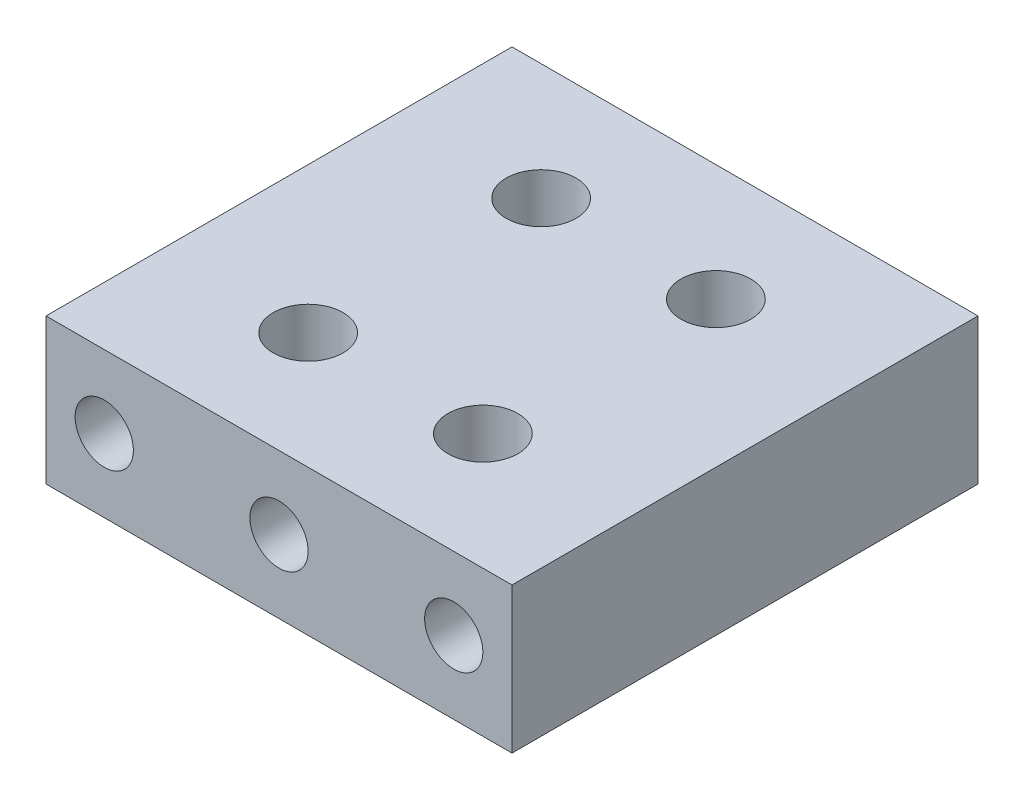
ISO-10303-21;
HEADER;
FILE_DESCRIPTION(('STEP AP214'),'2;1');
FILE_NAME('part.step','',(''),(''),'','','');
FILE_SCHEMA(('AUTOMOTIVE_DESIGN { 1 0 10303 214 1 1 1 1 }'));
ENDSEC;
DATA;
#1=APPLICATION_CONTEXT('core data for automotive mechanical design processes');
#2=APPLICATION_PROTOCOL_DEFINITION('international standard','automotive_design',2000,#1);
#3=PRODUCT_CONTEXT('',#1,'mechanical');
#4=PRODUCT('Part','Part','',(#3));
#5=PRODUCT_RELATED_PRODUCT_CATEGORY('part','',(#4));
#6=PRODUCT_DEFINITION_FORMATION('','',#4);
#7=PRODUCT_DEFINITION_CONTEXT('part definition',#1,'design');
#8=PRODUCT_DEFINITION('design','',#6,#7);
#9=PRODUCT_DEFINITION_SHAPE('','',#8);
#10=(LENGTH_UNIT() NAMED_UNIT(*) SI_UNIT(.MILLI.,.METRE.));
#11=(NAMED_UNIT(*) PLANE_ANGLE_UNIT() SI_UNIT($,.RADIAN.));
#12=(NAMED_UNIT(*) SI_UNIT($,.STERADIAN.) SOLID_ANGLE_UNIT());
#13=UNCERTAINTY_MEASURE_WITH_UNIT(LENGTH_MEASURE(1.E-05),#10,'distance_accuracy_value','');
#14=(GEOMETRIC_REPRESENTATION_CONTEXT(3) GLOBAL_UNCERTAINTY_ASSIGNED_CONTEXT((#13)) GLOBAL_UNIT_ASSIGNED_CONTEXT((#10,
#11,#12)) REPRESENTATION_CONTEXT('',''));
#15=CARTESIAN_POINT('',(0.,0.,0.));
#16=DIRECTION('',(0.,0.,1.));
#17=DIRECTION('',(1.,0.,0.));
#18=AXIS2_PLACEMENT_3D('',#15,#16,#17);
#19=CARTESIAN_POINT('',(-9.525,15.875,12.7));
#20=DIRECTION('',(0.,1.,0.));
#21=DIRECTION('',(0.,0.,1.));
#22=AXIS2_PLACEMENT_3D('',#19,#20,#21);
#23=CYLINDRICAL_SURFACE('',#22,1.7272);
#24=CARTESIAN_POINT('',(-9.525,0.,12.7));
#25=DIRECTION('',(0.,1.,0.));
#26=DIRECTION('',(0.,0.,1.));
#27=AXIS2_PLACEMENT_3D('',#24,#25,#26);
#28=CIRCLE('',#27,1.7272);
#29=CARTESIAN_POINT('',(-9.525,0.,14.4272));
#30=VERTEX_POINT('',#29);
#31=EDGE_CURVE('E114',#30,#30,#28,.T.);
#32=ORIENTED_EDGE('',*,*,#31,.F.);
#33=EDGE_LOOP('',(#32));
#34=FACE_BOUND('',#33,.T.);
#35=CARTESIAN_POINT('',(-9.525,9.525,12.7));
#36=DIRECTION('',(0.,1.,0.));
#37=DIRECTION('',(0.,0.,1.));
#38=AXIS2_PLACEMENT_3D('',#35,#36,#37);
#39=CIRCLE('',#38,1.7272);
#40=CARTESIAN_POINT('',(-9.525,9.525,14.4272));
#41=VERTEX_POINT('',#40);
#42=EDGE_CURVE('E39',#41,#41,#39,.F.);
#43=ORIENTED_EDGE('',*,*,#42,.F.);
#44=EDGE_LOOP('',(#43));
#45=FACE_BOUND('',#44,.T.);
#46=ADVANCED_FACE('F35',(#34,#45),#23,.F.);
#47=CARTESIAN_POINT('',(9.525,15.875,12.7));
#48=DIRECTION('',(0.,1.,0.));
#49=DIRECTION('',(0.,0.,1.));
#50=AXIS2_PLACEMENT_3D('',#47,#48,#49);
#51=CYLINDRICAL_SURFACE('',#50,1.7272);
#52=CARTESIAN_POINT('',(9.525,0.,12.7));
#53=DIRECTION('',(0.,1.,0.));
#54=DIRECTION('',(0.,0.,1.));
#55=AXIS2_PLACEMENT_3D('',#52,#53,#54);
#56=CIRCLE('',#55,1.7272);
#57=CARTESIAN_POINT('',(9.525,0.,14.4272));
#58=VERTEX_POINT('',#57);
#59=EDGE_CURVE('E153',#58,#58,#56,.T.);
#60=ORIENTED_EDGE('',*,*,#59,.F.);
#61=EDGE_LOOP('',(#60));
#62=FACE_BOUND('',#61,.T.);
#63=CARTESIAN_POINT('',(9.525,9.525,12.7));
#64=DIRECTION('',(0.,1.,0.));
#65=DIRECTION('',(0.,0.,1.));
#66=AXIS2_PLACEMENT_3D('',#63,#64,#65);
#67=CIRCLE('',#66,1.7272);
#68=CARTESIAN_POINT('',(9.525,9.525,14.4272));
#69=VERTEX_POINT('',#68);
#70=EDGE_CURVE('E120',#69,#69,#67,.F.);
#71=ORIENTED_EDGE('',*,*,#70,.F.);
#72=EDGE_LOOP('',(#71));
#73=FACE_BOUND('',#72,.T.);
#74=ADVANCED_FACE('F189',(#62,#73),#51,.F.);
#75=CARTESIAN_POINT('',(9.525,15.875,-12.7));
#76=DIRECTION('',(0.,1.,0.));
#77=DIRECTION('',(0.,0.,1.));
#78=AXIS2_PLACEMENT_3D('',#75,#76,#77);
#79=CYLINDRICAL_SURFACE('',#78,1.7272);
#80=CARTESIAN_POINT('',(9.525,0.,-12.7));
#81=DIRECTION('',(0.,1.,0.));
#82=DIRECTION('',(0.,0.,1.));
#83=AXIS2_PLACEMENT_3D('',#80,#81,#82);
#84=CIRCLE('',#83,1.7272);
#85=CARTESIAN_POINT('',(9.525,0.,-10.9728));
#86=VERTEX_POINT('',#85);
#87=EDGE_CURVE('E150',#86,#86,#84,.T.);
#88=ORIENTED_EDGE('',*,*,#87,.F.);
#89=EDGE_LOOP('',(#88));
#90=FACE_BOUND('',#89,.T.);
#91=CARTESIAN_POINT('',(9.525,9.525,-12.7));
#92=DIRECTION('',(0.,1.,0.));
#93=DIRECTION('',(0.,0.,1.));
#94=AXIS2_PLACEMENT_3D('',#91,#92,#93);
#95=CIRCLE('',#94,1.7272);
#96=CARTESIAN_POINT('',(9.525,9.525,-10.9728));
#97=VERTEX_POINT('',#96);
#98=EDGE_CURVE('E116',#97,#97,#95,.F.);
#99=ORIENTED_EDGE('',*,*,#98,.F.);
#100=EDGE_LOOP('',(#99));
#101=FACE_BOUND('',#100,.T.);
#102=ADVANCED_FACE('F195',(#90,#101),#79,.F.);
#103=CARTESIAN_POINT('',(-9.525,15.875,-12.7));
#104=DIRECTION('',(0.,1.,0.));
#105=DIRECTION('',(0.,0.,1.));
#106=AXIS2_PLACEMENT_3D('',#103,#104,#105);
#107=CYLINDRICAL_SURFACE('',#106,1.7272);
#108=CARTESIAN_POINT('',(-9.525,0.,-12.7));
#109=DIRECTION('',(0.,1.,0.));
#110=DIRECTION('',(0.,0.,1.));
#111=AXIS2_PLACEMENT_3D('',#108,#109,#110);
#112=CIRCLE('',#111,1.7272);
#113=CARTESIAN_POINT('',(-9.525,0.,-10.9728));
#114=VERTEX_POINT('',#113);
#115=EDGE_CURVE('E147',#114,#114,#112,.T.);
#116=ORIENTED_EDGE('',*,*,#115,.F.);
#117=EDGE_LOOP('',(#116));
#118=FACE_BOUND('',#117,.T.);
#119=CARTESIAN_POINT('',(-9.525,9.525,-12.7));
#120=DIRECTION('',(0.,1.,0.));
#121=DIRECTION('',(0.,0.,1.));
#122=AXIS2_PLACEMENT_3D('',#119,#120,#121);
#123=CIRCLE('',#122,1.7272);
#124=CARTESIAN_POINT('',(-9.525,9.525,-10.9728));
#125=VERTEX_POINT('',#124);
#126=EDGE_CURVE('E111',#125,#125,#123,.F.);
#127=ORIENTED_EDGE('',*,*,#126,.F.);
#128=EDGE_LOOP('',(#127));
#129=FACE_BOUND('',#128,.T.);
#130=ADVANCED_FACE('F184',(#118,#129),#107,.F.);
#131=CARTESIAN_POINT('',(-25.4,15.875,-25.4));
#132=DIRECTION('',(1.,0.,0.));
#133=DIRECTION('',(0.,0.,-1.));
#134=AXIS2_PLACEMENT_3D('',#131,#132,#133);
#135=PLANE('',#134);
#136=DIRECTION('',(0.,0.,1.));
#137=VECTOR('',#136,1.);
#138=CARTESIAN_POINT('',(-25.4,0.,-25.4));
#139=LINE('',#138,#137);
#140=CARTESIAN_POINT('',(-25.4,0.,-25.4));
#141=VERTEX_POINT('',#140);
#142=CARTESIAN_POINT('',(-25.4,0.,25.4));
#143=VERTEX_POINT('',#142);
#144=EDGE_CURVE('E102',#141,#143,#139,.T.);
#145=ORIENTED_EDGE('',*,*,#144,.T.);
#146=DIRECTION('',(0.,-1.,0.));
#147=VECTOR('',#146,1.);
#148=CARTESIAN_POINT('',(-25.4,15.875,25.4));
#149=LINE('',#148,#147);
#150=CARTESIAN_POINT('',(-25.4,15.875,25.4));
#151=VERTEX_POINT('',#150);
#152=EDGE_CURVE('E11',#151,#143,#149,.T.);
#153=ORIENTED_EDGE('',*,*,#152,.F.);
#154=DIRECTION('',(0.,0.,1.));
#155=VECTOR('',#154,1.);
#156=CARTESIAN_POINT('',(-25.4,15.875,-25.4));
#157=LINE('',#156,#155);
#158=CARTESIAN_POINT('',(-25.4,15.875,-25.4));
#159=VERTEX_POINT('',#158);
#160=EDGE_CURVE('E89',#159,#151,#157,.T.);
#161=ORIENTED_EDGE('',*,*,#160,.F.);
#162=DIRECTION('',(0.,-1.,0.));
#163=VECTOR('',#162,1.);
#164=CARTESIAN_POINT('',(-25.4,15.875,-25.4));
#165=LINE('',#164,#163);
#166=EDGE_CURVE('E98',#159,#141,#165,.T.);
#167=ORIENTED_EDGE('',*,*,#166,.T.);
#168=EDGE_LOOP('',(#145,#153,#161,#167));
#169=FACE_BOUND('',#168,.T.);
#170=ADVANCED_FACE('F37',(#169),#135,.F.);
#171=CARTESIAN_POINT('',(-25.4,15.875,25.4));
#172=DIRECTION('',(0.,0.,-1.));
#173=DIRECTION('',(-1.,0.,0.));
#174=AXIS2_PLACEMENT_3D('',#171,#172,#173);
#175=PLANE('',#174);
#176=CARTESIAN_POINT('',(19.05,7.9375,25.4));
#177=DIRECTION('',(0.,0.,1.));
#178=DIRECTION('',(1.,0.,0.));
#179=AXIS2_PLACEMENT_3D('',#176,#177,#178);
#180=CIRCLE('',#179,3.175);
#181=CARTESIAN_POINT('',(22.225,7.9375,25.4));
#182=VERTEX_POINT('',#181);
#183=EDGE_CURVE('E156',#182,#182,#180,.T.);
#184=ORIENTED_EDGE('',*,*,#183,.F.);
#185=EDGE_LOOP('',(#184));
#186=FACE_BOUND('',#185,.T.);
#187=CARTESIAN_POINT('',(0.,7.9375,25.4));
#188=DIRECTION('',(0.,0.,1.));
#189=DIRECTION('',(1.,0.,0.));
#190=AXIS2_PLACEMENT_3D('',#187,#188,#189);
#191=CIRCLE('',#190,3.175);
#192=CARTESIAN_POINT('',(3.175,7.9375,25.4));
#193=VERTEX_POINT('',#192);
#194=EDGE_CURVE('E160',#193,#193,#191,.T.);
#195=ORIENTED_EDGE('',*,*,#194,.F.);
#196=EDGE_LOOP('',(#195));
#197=FACE_BOUND('',#196,.T.);
#198=CARTESIAN_POINT('',(-19.05,7.9375,25.4));
#199=DIRECTION('',(0.,0.,1.));
#200=DIRECTION('',(1.,0.,0.));
#201=AXIS2_PLACEMENT_3D('',#198,#199,#200);
#202=CIRCLE('',#201,3.175);
#203=CARTESIAN_POINT('',(-15.875,7.9375,25.4));
#204=VERTEX_POINT('',#203);
#205=EDGE_CURVE('E166',#204,#204,#202,.T.);
#206=ORIENTED_EDGE('',*,*,#205,.F.);
#207=EDGE_LOOP('',(#206));
#208=FACE_BOUND('',#207,.T.);
#209=DIRECTION('',(1.,0.,0.));
#210=VECTOR('',#209,1.);
#211=CARTESIAN_POINT('',(-25.4,0.,25.4));
#212=LINE('',#211,#210);
#213=CARTESIAN_POINT('',(25.4,0.,25.4));
#214=VERTEX_POINT('',#213);
#215=EDGE_CURVE('E93',#143,#214,#212,.T.);
#216=ORIENTED_EDGE('',*,*,#215,.T.);
#217=DIRECTION('',(0.,-1.,0.));
#218=VECTOR('',#217,1.);
#219=CARTESIAN_POINT('',(25.4,15.875,25.4));
#220=LINE('',#219,#218);
#221=CARTESIAN_POINT('',(25.4,15.875,25.4));
#222=VERTEX_POINT('',#221);
#223=EDGE_CURVE('E45',#222,#214,#220,.T.);
#224=ORIENTED_EDGE('',*,*,#223,.F.);
#225=DIRECTION('',(1.,0.,0.));
#226=VECTOR('',#225,1.);
#227=CARTESIAN_POINT('',(-25.4,15.875,25.4));
#228=LINE('',#227,#226);
#229=EDGE_CURVE('E84',#151,#222,#228,.T.);
#230=ORIENTED_EDGE('',*,*,#229,.F.);
#231=ORIENTED_EDGE('',*,*,#152,.T.);
#232=EDGE_LOOP('',(#216,#224,#230,#231));
#233=FACE_BOUND('',#232,.T.);
#234=ADVANCED_FACE('F92',(#186,#197,#208,#233),#175,.F.);
#235=CARTESIAN_POINT('',(25.4,15.875,-25.4));
#236=DIRECTION('',(-1.,0.,0.));
#237=DIRECTION('',(0.,0.,1.));
#238=AXIS2_PLACEMENT_3D('',#235,#236,#237);
#239=PLANE('',#238);
#240=DIRECTION('',(0.,0.,-1.));
#241=VECTOR('',#240,1.);
#242=CARTESIAN_POINT('',(25.4,0.,-25.4));
#243=LINE('',#242,#241);
#244=CARTESIAN_POINT('',(25.4,0.,-25.4));
#245=VERTEX_POINT('',#244);
#246=EDGE_CURVE('E71',#214,#245,#243,.T.);
#247=ORIENTED_EDGE('',*,*,#246,.T.);
#248=DIRECTION('',(0.,-1.,0.));
#249=VECTOR('',#248,1.);
#250=CARTESIAN_POINT('',(25.4,15.875,-25.4));
#251=LINE('',#250,#249);
#252=CARTESIAN_POINT('',(25.4,15.875,-25.4));
#253=VERTEX_POINT('',#252);
#254=EDGE_CURVE('E94',#253,#245,#251,.T.);
#255=ORIENTED_EDGE('',*,*,#254,.F.);
#256=DIRECTION('',(0.,0.,-1.));
#257=VECTOR('',#256,1.);
#258=CARTESIAN_POINT('',(25.4,15.875,-25.4));
#259=LINE('',#258,#257);
#260=EDGE_CURVE('E87',#222,#253,#259,.T.);
#261=ORIENTED_EDGE('',*,*,#260,.F.);
#262=ORIENTED_EDGE('',*,*,#223,.T.);
#263=EDGE_LOOP('',(#247,#255,#261,#262));
#264=FACE_BOUND('',#263,.T.);
#265=ADVANCED_FACE('F96',(#264),#239,.F.);
#266=CARTESIAN_POINT('',(-25.4,15.875,-25.4));
#267=DIRECTION('',(0.,0.,1.));
#268=DIRECTION('',(1.,0.,0.));
#269=AXIS2_PLACEMENT_3D('',#266,#267,#268);
#270=PLANE('',#269);
#271=CARTESIAN_POINT('',(19.05,7.9375,-25.4));
#272=DIRECTION('',(0.,0.,1.));
#273=DIRECTION('',(1.,0.,0.));
#274=AXIS2_PLACEMENT_3D('',#271,#272,#273);
#275=CIRCLE('',#274,3.175);
#276=CARTESIAN_POINT('',(22.225,7.9375,-25.4));
#277=VERTEX_POINT('',#276);
#278=EDGE_CURVE('E157',#277,#277,#275,.T.);
#279=ORIENTED_EDGE('',*,*,#278,.T.);
#280=EDGE_LOOP('',(#279));
#281=FACE_BOUND('',#280,.T.);
#282=CARTESIAN_POINT('',(0.,7.9375,-25.4));
#283=DIRECTION('',(0.,0.,1.));
#284=DIRECTION('',(1.,0.,0.));
#285=AXIS2_PLACEMENT_3D('',#282,#283,#284);
#286=CIRCLE('',#285,3.175);
#287=CARTESIAN_POINT('',(3.175,7.9375,-25.4));
#288=VERTEX_POINT('',#287);
#289=EDGE_CURVE('E163',#288,#288,#286,.T.);
#290=ORIENTED_EDGE('',*,*,#289,.T.);
#291=EDGE_LOOP('',(#290));
#292=FACE_BOUND('',#291,.T.);
#293=CARTESIAN_POINT('',(-19.05,7.9375,-25.4));
#294=DIRECTION('',(0.,0.,1.));
#295=DIRECTION('',(1.,0.,0.));
#296=AXIS2_PLACEMENT_3D('',#293,#294,#295);
#297=CIRCLE('',#296,3.175);
#298=CARTESIAN_POINT('',(-15.875,7.9375,-25.4));
#299=VERTEX_POINT('',#298);
#300=EDGE_CURVE('E105',#299,#299,#297,.T.);
#301=ORIENTED_EDGE('',*,*,#300,.T.);
#302=EDGE_LOOP('',(#301));
#303=FACE_BOUND('',#302,.T.);
#304=DIRECTION('',(-1.,0.,0.));
#305=VECTOR('',#304,1.);
#306=CARTESIAN_POINT('',(-25.4,0.,-25.4));
#307=LINE('',#306,#305);
#308=EDGE_CURVE('E77',#245,#141,#307,.T.);
#309=ORIENTED_EDGE('',*,*,#308,.T.);
#310=ORIENTED_EDGE('',*,*,#166,.F.);
#311=DIRECTION('',(-1.,0.,0.));
#312=VECTOR('',#311,1.);
#313=CARTESIAN_POINT('',(-25.4,15.875,-25.4));
#314=LINE('',#313,#312);
#315=EDGE_CURVE('E54',#253,#159,#314,.T.);
#316=ORIENTED_EDGE('',*,*,#315,.F.);
#317=ORIENTED_EDGE('',*,*,#254,.T.);
#318=EDGE_LOOP('',(#309,#310,#316,#317));
#319=FACE_BOUND('',#318,.T.);
#320=ADVANCED_FACE('F182',(#281,#292,#303,#319),#270,.F.);
#321=CARTESIAN_POINT('',(0.,15.875,0.));
#322=DIRECTION('',(0.,1.,0.));
#323=DIRECTION('',(0.,0.,1.));
#324=AXIS2_PLACEMENT_3D('',#321,#322,#323);
#325=PLANE('',#324);
#326=CARTESIAN_POINT('',(-9.525,15.875,12.7));
#327=DIRECTION('',(0.,1.,0.));
#328=DIRECTION('',(0.,0.,1.));
#329=AXIS2_PLACEMENT_3D('',#326,#327,#328);
#330=CIRCLE('',#329,3.81);
#331=CARTESIAN_POINT('',(-9.525,15.875,16.51));
#332=VERTEX_POINT('',#331);
#333=EDGE_CURVE('E136',#332,#332,#330,.T.);
#334=ORIENTED_EDGE('',*,*,#333,.F.);
#335=EDGE_LOOP('',(#334));
#336=FACE_BOUND('',#335,.T.);
#337=CARTESIAN_POINT('',(9.525,15.875,12.7));
#338=DIRECTION('',(0.,1.,0.));
#339=DIRECTION('',(0.,0.,1.));
#340=AXIS2_PLACEMENT_3D('',#337,#338,#339);
#341=CIRCLE('',#340,3.81);
#342=CARTESIAN_POINT('',(9.525,15.875,16.51));
#343=VERTEX_POINT('',#342);
#344=EDGE_CURVE('E129',#343,#343,#341,.T.);
#345=ORIENTED_EDGE('',*,*,#344,.F.);
#346=EDGE_LOOP('',(#345));
#347=FACE_BOUND('',#346,.T.);
#348=CARTESIAN_POINT('',(9.525,15.875,-12.7));
#349=DIRECTION('',(0.,1.,0.));
#350=DIRECTION('',(0.,0.,1.));
#351=AXIS2_PLACEMENT_3D('',#348,#349,#350);
#352=CIRCLE('',#351,3.81);
#353=CARTESIAN_POINT('',(9.525,15.875,-8.89));
#354=VERTEX_POINT('',#353);
#355=EDGE_CURVE('E122',#354,#354,#352,.T.);
#356=ORIENTED_EDGE('',*,*,#355,.F.);
#357=EDGE_LOOP('',(#356));
#358=FACE_BOUND('',#357,.T.);
#359=CARTESIAN_POINT('',(-9.525,15.875,-12.7));
#360=DIRECTION('',(0.,1.,0.));
#361=DIRECTION('',(0.,0.,1.));
#362=AXIS2_PLACEMENT_3D('',#359,#360,#361);
#363=CIRCLE('',#362,3.81);
#364=CARTESIAN_POINT('',(-9.525,15.875,-8.89));
#365=VERTEX_POINT('',#364);
#366=EDGE_CURVE('E118',#365,#365,#363,.T.);
#367=ORIENTED_EDGE('',*,*,#366,.F.);
#368=EDGE_LOOP('',(#367));
#369=FACE_BOUND('',#368,.T.);
#370=ORIENTED_EDGE('',*,*,#160,.T.);
#371=ORIENTED_EDGE('',*,*,#229,.T.);
#372=ORIENTED_EDGE('',*,*,#260,.T.);
#373=ORIENTED_EDGE('',*,*,#315,.T.);
#374=EDGE_LOOP('',(#370,#371,#372,#373));
#375=FACE_BOUND('',#374,.T.);
#376=ADVANCED_FACE('F85',(#336,#347,#358,#369,#375),#325,.T.);
#377=CARTESIAN_POINT('',(0.,0.,0.));
#378=DIRECTION('',(0.,1.,0.));
#379=DIRECTION('',(0.,0.,1.));
#380=AXIS2_PLACEMENT_3D('',#377,#378,#379);
#381=PLANE('',#380);
#382=ORIENTED_EDGE('',*,*,#31,.T.);
#383=EDGE_LOOP('',(#382));
#384=FACE_BOUND('',#383,.T.);
#385=ORIENTED_EDGE('',*,*,#115,.T.);
#386=EDGE_LOOP('',(#385));
#387=FACE_BOUND('',#386,.T.);
#388=ORIENTED_EDGE('',*,*,#87,.T.);
#389=EDGE_LOOP('',(#388));
#390=FACE_BOUND('',#389,.T.);
#391=ORIENTED_EDGE('',*,*,#59,.T.);
#392=EDGE_LOOP('',(#391));
#393=FACE_BOUND('',#392,.T.);
#394=ORIENTED_EDGE('',*,*,#144,.F.);
#395=ORIENTED_EDGE('',*,*,#308,.F.);
#396=ORIENTED_EDGE('',*,*,#246,.F.);
#397=ORIENTED_EDGE('',*,*,#215,.F.);
#398=EDGE_LOOP('',(#394,#395,#396,#397));
#399=FACE_BOUND('',#398,.T.);
#400=ADVANCED_FACE('F221',(#384,#387,#390,#393,#399),#381,.F.);
#401=CARTESIAN_POINT('',(-19.05,7.9375,-25.4));
#402=DIRECTION('',(0.,0.,1.));
#403=DIRECTION('',(1.,0.,0.));
#404=AXIS2_PLACEMENT_3D('',#401,#402,#403);
#405=CYLINDRICAL_SURFACE('',#404,3.175);
#406=ORIENTED_EDGE('',*,*,#300,.F.);
#407=EDGE_LOOP('',(#406));
#408=FACE_BOUND('',#407,.T.);
#409=ORIENTED_EDGE('',*,*,#205,.T.);
#410=EDGE_LOOP('',(#409));
#411=FACE_BOUND('',#410,.T.);
#412=ADVANCED_FACE('F174',(#408,#411),#405,.F.);
#413=CARTESIAN_POINT('',(0.,7.9375,-25.4));
#414=DIRECTION('',(0.,0.,1.));
#415=DIRECTION('',(1.,0.,0.));
#416=AXIS2_PLACEMENT_3D('',#413,#414,#415);
#417=CYLINDRICAL_SURFACE('',#416,3.175);
#418=ORIENTED_EDGE('',*,*,#289,.F.);
#419=EDGE_LOOP('',(#418));
#420=FACE_BOUND('',#419,.T.);
#421=ORIENTED_EDGE('',*,*,#194,.T.);
#422=EDGE_LOOP('',(#421));
#423=FACE_BOUND('',#422,.T.);
#424=ADVANCED_FACE('F214',(#420,#423),#417,.F.);
#425=CARTESIAN_POINT('',(19.05,7.9375,-25.4));
#426=DIRECTION('',(0.,0.,1.));
#427=DIRECTION('',(1.,0.,0.));
#428=AXIS2_PLACEMENT_3D('',#425,#426,#427);
#429=CYLINDRICAL_SURFACE('',#428,3.175);
#430=ORIENTED_EDGE('',*,*,#278,.F.);
#431=EDGE_LOOP('',(#430));
#432=FACE_BOUND('',#431,.T.);
#433=ORIENTED_EDGE('',*,*,#183,.T.);
#434=EDGE_LOOP('',(#433));
#435=FACE_BOUND('',#434,.T.);
#436=ADVANCED_FACE('F210',(#432,#435),#429,.F.);
#437=CARTESIAN_POINT('',(-9.525,9.525,-12.7));
#438=DIRECTION('',(0.,1.,0.));
#439=DIRECTION('',(0.,0.,1.));
#440=AXIS2_PLACEMENT_3D('',#437,#438,#439);
#441=PLANE('',#440);
#442=CARTESIAN_POINT('',(-9.525,9.525,-12.7));
#443=DIRECTION('',(0.,1.,0.));
#444=DIRECTION('',(0.,0.,1.));
#445=AXIS2_PLACEMENT_3D('',#442,#443,#444);
#446=CIRCLE('',#445,3.81);
#447=CARTESIAN_POINT('',(-9.525,9.525,-8.89));
#448=VERTEX_POINT('',#447);
#449=EDGE_CURVE('E115',#448,#448,#446,.T.);
#450=ORIENTED_EDGE('',*,*,#449,.T.);
#451=EDGE_LOOP('',(#450));
#452=FACE_BOUND('',#451,.T.);
#453=ORIENTED_EDGE('',*,*,#126,.T.);
#454=EDGE_LOOP('',(#453));
#455=FACE_BOUND('',#454,.T.);
#456=ADVANCED_FACE('F213',(#452,#455),#441,.T.);
#457=CARTESIAN_POINT('',(-9.525,9.525,-12.7));
#458=DIRECTION('',(0.,1.,0.));
#459=DIRECTION('',(0.,0.,1.));
#460=AXIS2_PLACEMENT_3D('',#457,#458,#459);
#461=CYLINDRICAL_SURFACE('',#460,3.81);
#462=ORIENTED_EDGE('',*,*,#449,.F.);
#463=EDGE_LOOP('',(#462));
#464=FACE_BOUND('',#463,.T.);
#465=ORIENTED_EDGE('',*,*,#366,.T.);
#466=EDGE_LOOP('',(#465));
#467=FACE_BOUND('',#466,.T.);
#468=ADVANCED_FACE('F202',(#464,#467),#461,.F.);
#469=CARTESIAN_POINT('',(9.525,9.525,-12.7));
#470=DIRECTION('',(0.,1.,0.));
#471=DIRECTION('',(0.,0.,1.));
#472=AXIS2_PLACEMENT_3D('',#469,#470,#471);
#473=PLANE('',#472);
#474=CARTESIAN_POINT('',(9.525,9.525,-12.7));
#475=DIRECTION('',(0.,1.,0.));
#476=DIRECTION('',(0.,0.,1.));
#477=AXIS2_PLACEMENT_3D('',#474,#475,#476);
#478=CIRCLE('',#477,3.81);
#479=CARTESIAN_POINT('',(9.525,9.525,-8.89));
#480=VERTEX_POINT('',#479);
#481=EDGE_CURVE('E119',#480,#480,#478,.T.);
#482=ORIENTED_EDGE('',*,*,#481,.T.);
#483=EDGE_LOOP('',(#482));
#484=FACE_BOUND('',#483,.T.);
#485=ORIENTED_EDGE('',*,*,#98,.T.);
#486=EDGE_LOOP('',(#485));
#487=FACE_BOUND('',#486,.T.);
#488=ADVANCED_FACE('F276',(#484,#487),#473,.T.);
#489=CARTESIAN_POINT('',(9.525,9.525,-12.7));
#490=DIRECTION('',(0.,1.,0.));
#491=DIRECTION('',(0.,0.,1.));
#492=AXIS2_PLACEMENT_3D('',#489,#490,#491);
#493=CYLINDRICAL_SURFACE('',#492,3.81);
#494=ORIENTED_EDGE('',*,*,#481,.F.);
#495=EDGE_LOOP('',(#494));
#496=FACE_BOUND('',#495,.T.);
#497=ORIENTED_EDGE('',*,*,#355,.T.);
#498=EDGE_LOOP('',(#497));
#499=FACE_BOUND('',#498,.T.);
#500=ADVANCED_FACE('F283',(#496,#499),#493,.F.);
#501=CARTESIAN_POINT('',(9.525,9.525,12.7));
#502=DIRECTION('',(0.,1.,0.));
#503=DIRECTION('',(0.,0.,1.));
#504=AXIS2_PLACEMENT_3D('',#501,#502,#503);
#505=PLANE('',#504);
#506=CARTESIAN_POINT('',(9.525,9.525,12.7));
#507=DIRECTION('',(0.,1.,0.));
#508=DIRECTION('',(0.,0.,1.));
#509=AXIS2_PLACEMENT_3D('',#506,#507,#508);
#510=CIRCLE('',#509,3.81);
#511=CARTESIAN_POINT('',(9.525,9.525,16.51));
#512=VERTEX_POINT('',#511);
#513=EDGE_CURVE('E123',#512,#512,#510,.T.);
#514=ORIENTED_EDGE('',*,*,#513,.T.);
#515=EDGE_LOOP('',(#514));
#516=FACE_BOUND('',#515,.T.);
#517=ORIENTED_EDGE('',*,*,#70,.T.);
#518=EDGE_LOOP('',(#517));
#519=FACE_BOUND('',#518,.T.);
#520=ADVANCED_FACE('F291',(#516,#519),#505,.T.);
#521=CARTESIAN_POINT('',(9.525,9.525,12.7));
#522=DIRECTION('',(0.,1.,0.));
#523=DIRECTION('',(0.,0.,1.));
#524=AXIS2_PLACEMENT_3D('',#521,#522,#523);
#525=CYLINDRICAL_SURFACE('',#524,3.81);
#526=ORIENTED_EDGE('',*,*,#513,.F.);
#527=EDGE_LOOP('',(#526));
#528=FACE_BOUND('',#527,.T.);
#529=ORIENTED_EDGE('',*,*,#344,.T.);
#530=EDGE_LOOP('',(#529));
#531=FACE_BOUND('',#530,.T.);
#532=ADVANCED_FACE('F299',(#528,#531),#525,.F.);
#533=CARTESIAN_POINT('',(-9.525,9.525,12.7));
#534=DIRECTION('',(0.,1.,0.));
#535=DIRECTION('',(0.,0.,1.));
#536=AXIS2_PLACEMENT_3D('',#533,#534,#535);
#537=PLANE('',#536);
#538=CARTESIAN_POINT('',(-9.525,9.525,12.7));
#539=DIRECTION('',(0.,1.,0.));
#540=DIRECTION('',(0.,0.,1.));
#541=AXIS2_PLACEMENT_3D('',#538,#539,#540);
#542=CIRCLE('',#541,3.81);
#543=CARTESIAN_POINT('',(-9.525,9.525,16.51));
#544=VERTEX_POINT('',#543);
#545=EDGE_CURVE('E391',#544,#544,#542,.T.);
#546=ORIENTED_EDGE('',*,*,#545,.T.);
#547=EDGE_LOOP('',(#546));
#548=FACE_BOUND('',#547,.T.);
#549=ORIENTED_EDGE('',*,*,#42,.T.);
#550=EDGE_LOOP('',(#549));
#551=FACE_BOUND('',#550,.T.);
#552=ADVANCED_FACE('F306',(#548,#551),#537,.T.);
#553=CARTESIAN_POINT('',(-9.525,9.525,12.7));
#554=DIRECTION('',(0.,1.,0.));
#555=DIRECTION('',(0.,0.,1.));
#556=AXIS2_PLACEMENT_3D('',#553,#554,#555);
#557=CYLINDRICAL_SURFACE('',#556,3.81);
#558=ORIENTED_EDGE('',*,*,#545,.F.);
#559=EDGE_LOOP('',(#558));
#560=FACE_BOUND('',#559,.T.);
#561=ORIENTED_EDGE('',*,*,#333,.T.);
#562=EDGE_LOOP('',(#561));
#563=FACE_BOUND('',#562,.T.);
#564=ADVANCED_FACE('F314',(#560,#563),#557,.F.);
#565=CLOSED_SHELL('',(#46,#74,#102,#130,#170,#234,#265,#320,#376,#400,#412,#424,#436,#456,#468,
#488,#500,#520,#532,#552,#564));
#566=MANIFOLD_SOLID_BREP('B2',#565);
#567=ADVANCED_BREP_SHAPE_REPRESENTATION('',(#18,#566),#14);
#568=SHAPE_DEFINITION_REPRESENTATION(#9,#567);
ENDSEC;
END-ISO-10303-21;
